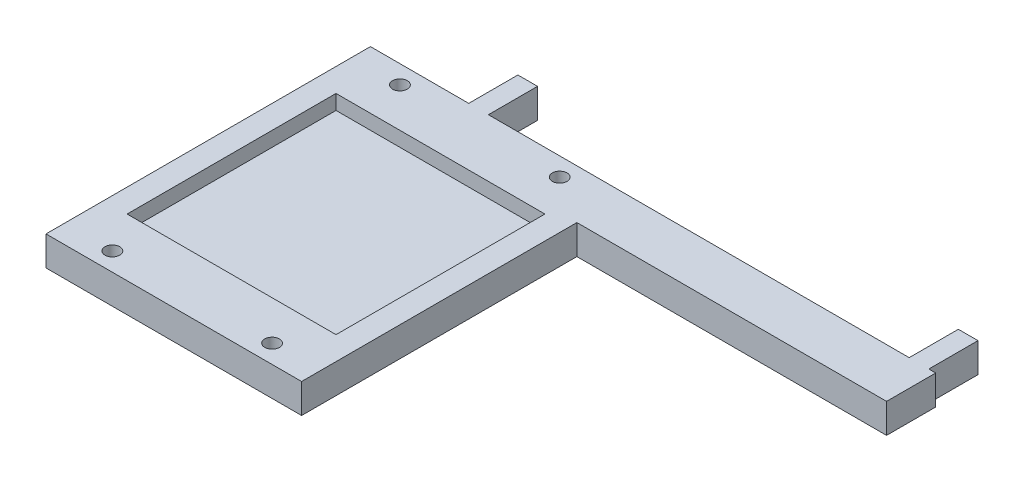
ISO-10303-21;
HEADER;
FILE_DESCRIPTION(('STEP AP214'),'2;1');
FILE_NAME('part.step','',(''),(''),'','','');
FILE_SCHEMA(('AUTOMOTIVE_DESIGN { 1 0 10303 214 1 1 1 1 }'));
ENDSEC;
DATA;
#1=APPLICATION_CONTEXT('core data for automotive mechanical design processes');
#2=APPLICATION_PROTOCOL_DEFINITION('international standard','automotive_design',2000,#1);
#3=PRODUCT_CONTEXT('',#1,'mechanical');
#4=PRODUCT('Part','Part','',(#3));
#5=PRODUCT_RELATED_PRODUCT_CATEGORY('part','',(#4));
#6=PRODUCT_DEFINITION_FORMATION('','',#4);
#7=PRODUCT_DEFINITION_CONTEXT('part definition',#1,'design');
#8=PRODUCT_DEFINITION('design','',#6,#7);
#9=PRODUCT_DEFINITION_SHAPE('','',#8);
#10=(LENGTH_UNIT() NAMED_UNIT(*) SI_UNIT(.MILLI.,.METRE.));
#11=(NAMED_UNIT(*) PLANE_ANGLE_UNIT() SI_UNIT($,.RADIAN.));
#12=(NAMED_UNIT(*) SI_UNIT($,.STERADIAN.) SOLID_ANGLE_UNIT());
#13=UNCERTAINTY_MEASURE_WITH_UNIT(LENGTH_MEASURE(1.E-05),#10,'distance_accuracy_value','');
#14=(GEOMETRIC_REPRESENTATION_CONTEXT(3) GLOBAL_UNCERTAINTY_ASSIGNED_CONTEXT((#13)) GLOBAL_UNIT_ASSIGNED_CONTEXT((#10,
#11,#12)) REPRESENTATION_CONTEXT('',''));
#15=CARTESIAN_POINT('',(0.,0.,0.));
#16=DIRECTION('',(0.,0.,1.));
#17=DIRECTION('',(1.,0.,0.));
#18=AXIS2_PLACEMENT_3D('',#15,#16,#17);
#19=CARTESIAN_POINT('',(0.,6.,0.));
#20=DIRECTION('',(0.,0.,1.));
#21=DIRECTION('',(1.,0.,0.));
#22=AXIS2_PLACEMENT_3D('',#19,#20,#21);
#23=PLANE('',#22);
#24=DIRECTION('',(0.,1.,0.));
#25=VECTOR('',#24,1.);
#26=CARTESIAN_POINT('',(57.6,6.,0.));
#27=LINE('',#26,#25);
#28=CARTESIAN_POINT('',(57.6,0.,0.));
#29=VERTEX_POINT('',#28);
#30=CARTESIAN_POINT('',(57.6,6.,0.));
#31=VERTEX_POINT('',#30);
#32=EDGE_CURVE('E192',#29,#31,#27,.T.);
#33=ORIENTED_EDGE('',*,*,#32,.F.);
#34=DIRECTION('',(-1.,0.,0.));
#35=VECTOR('',#34,1.);
#36=CARTESIAN_POINT('',(0.,0.,0.));
#37=LINE('',#36,#35);
#38=CARTESIAN_POINT('',(-28.,0.,0.));
#39=VERTEX_POINT('',#38);
#40=EDGE_CURVE('E347',#29,#39,#37,.T.);
#41=ORIENTED_EDGE('',*,*,#40,.T.);
#42=DIRECTION('',(0.,-1.,0.));
#43=VECTOR('',#42,1.);
#44=CARTESIAN_POINT('',(-28.,6.,0.));
#45=LINE('',#44,#43);
#46=CARTESIAN_POINT('',(-28.,6.,0.));
#47=VERTEX_POINT('',#46);
#48=EDGE_CURVE('E199',#47,#39,#45,.T.);
#49=ORIENTED_EDGE('',*,*,#48,.F.);
#50=DIRECTION('',(-1.,0.,0.));
#51=VECTOR('',#50,1.);
#52=CARTESIAN_POINT('',(0.,6.,0.));
#53=LINE('',#52,#51);
#54=EDGE_CURVE('E57',#31,#47,#53,.T.);
#55=ORIENTED_EDGE('',*,*,#54,.F.);
#56=EDGE_LOOP('',(#33,#41,#49,#55));
#57=FACE_BOUND('',#56,.T.);
#58=ADVANCED_FACE('F39',(#57),#23,.F.);
#59=DIRECTION('',(0.,-1.,0.));
#60=VECTOR('',#59,1.);
#61=CARTESIAN_POINT('',(61.6,6.,0.));
#62=LINE('',#61,#60);
#63=CARTESIAN_POINT('',(61.6,6.,0.));
#64=VERTEX_POINT('',#63);
#65=CARTESIAN_POINT('',(61.6,0.,0.));
#66=VERTEX_POINT('',#65);
#67=EDGE_CURVE('E65',#64,#66,#62,.T.);
#68=ORIENTED_EDGE('',*,*,#67,.F.);
#69=CARTESIAN_POINT('',(63.,6.,0.));
#70=VERTEX_POINT('',#69);
#71=EDGE_CURVE('E330',#70,#64,#53,.T.);
#72=ORIENTED_EDGE('',*,*,#71,.F.);
#73=DIRECTION('',(0.,1.,0.));
#74=VECTOR('',#73,1.);
#75=CARTESIAN_POINT('',(63.,0.,0.));
#76=LINE('',#75,#74);
#77=CARTESIAN_POINT('',(63.,0.,0.));
#78=VERTEX_POINT('',#77);
#79=EDGE_CURVE('E238',#78,#70,#76,.T.);
#80=ORIENTED_EDGE('',*,*,#79,.F.);
#81=EDGE_CURVE('E343',#78,#66,#37,.T.);
#82=ORIENTED_EDGE('',*,*,#81,.T.);
#83=EDGE_LOOP('',(#68,#72,#80,#82));
#84=FACE_BOUND('',#83,.T.);
#85=ADVANCED_FACE('F428',(#84),#23,.F.);
#86=DIRECTION('',(0.,1.,0.));
#87=VECTOR('',#86,1.);
#88=CARTESIAN_POINT('',(-32.,6.,0.));
#89=LINE('',#88,#87);
#90=CARTESIAN_POINT('',(-32.,0.,0.));
#91=VERTEX_POINT('',#90);
#92=CARTESIAN_POINT('',(-32.,6.,0.));
#93=VERTEX_POINT('',#92);
#94=EDGE_CURVE('E194',#91,#93,#89,.T.);
#95=ORIENTED_EDGE('',*,*,#94,.F.);
#96=CARTESIAN_POINT('',(-52.,0.,0.));
#97=VERTEX_POINT('',#96);
#98=EDGE_CURVE('E342',#91,#97,#37,.T.);
#99=ORIENTED_EDGE('',*,*,#98,.T.);
#100=DIRECTION('',(0.,-1.,0.));
#101=VECTOR('',#100,1.);
#102=CARTESIAN_POINT('',(-52.,6.,0.));
#103=LINE('',#102,#101);
#104=CARTESIAN_POINT('',(-52.,6.,0.));
#105=VERTEX_POINT('',#104);
#106=EDGE_CURVE('E11',#105,#97,#103,.T.);
#107=ORIENTED_EDGE('',*,*,#106,.F.);
#108=EDGE_CURVE('E328',#93,#105,#53,.T.);
#109=ORIENTED_EDGE('',*,*,#108,.F.);
#110=EDGE_LOOP('',(#95,#99,#107,#109));
#111=FACE_BOUND('',#110,.T.);
#112=ADVANCED_FACE('F426',(#111),#23,.F.);
#113=CARTESIAN_POINT('',(0.,6.,0.));
#114=DIRECTION('',(-1.,0.,0.));
#115=DIRECTION('',(0.,0.,1.));
#116=AXIS2_PLACEMENT_3D('',#113,#114,#115);
#117=PLANE('',#116);
#118=DIRECTION('',(0.,-1.,0.));
#119=VECTOR('',#118,1.);
#120=CARTESIAN_POINT('',(0.,0.,10.));
#121=LINE('',#120,#119);
#122=CARTESIAN_POINT('',(0.,6.,10.));
#123=VERTEX_POINT('',#122);
#124=CARTESIAN_POINT('',(0.,0.,10.));
#125=VERTEX_POINT('',#124);
#126=EDGE_CURVE('E237',#123,#125,#121,.T.);
#127=ORIENTED_EDGE('',*,*,#126,.F.);
#128=DIRECTION('',(0.,0.,-1.));
#129=VECTOR('',#128,1.);
#130=CARTESIAN_POINT('',(0.,6.,0.));
#131=LINE('',#130,#129);
#132=CARTESIAN_POINT('',(0.,6.,66.));
#133=VERTEX_POINT('',#132);
#134=EDGE_CURVE('E325',#133,#123,#131,.T.);
#135=ORIENTED_EDGE('',*,*,#134,.F.);
#136=DIRECTION('',(0.,-1.,0.));
#137=VECTOR('',#136,1.);
#138=CARTESIAN_POINT('',(0.,6.,66.));
#139=LINE('',#138,#137);
#140=CARTESIAN_POINT('',(0.,0.,66.));
#141=VERTEX_POINT('',#140);
#142=EDGE_CURVE('E339',#133,#141,#139,.T.);
#143=ORIENTED_EDGE('',*,*,#142,.T.);
#144=DIRECTION('',(0.,0.,-1.));
#145=VECTOR('',#144,1.);
#146=CARTESIAN_POINT('',(0.,0.,0.));
#147=LINE('',#146,#145);
#148=EDGE_CURVE('E315',#141,#125,#147,.T.);
#149=ORIENTED_EDGE('',*,*,#148,.T.);
#150=EDGE_LOOP('',(#127,#135,#143,#149));
#151=FACE_BOUND('',#150,.T.);
#152=ADVANCED_FACE('F41',(#151),#117,.F.);
#153=CARTESIAN_POINT('',(-52.,6.,0.));
#154=DIRECTION('',(1.,0.,0.));
#155=DIRECTION('',(0.,0.,-1.));
#156=AXIS2_PLACEMENT_3D('',#153,#154,#155);
#157=PLANE('',#156);
#158=DIRECTION('',(0.,0.,1.));
#159=VECTOR('',#158,1.);
#160=CARTESIAN_POINT('',(-52.,0.,0.));
#161=LINE('',#160,#159);
#162=CARTESIAN_POINT('',(-52.,0.,66.));
#163=VERTEX_POINT('',#162);
#164=EDGE_CURVE('E346',#97,#163,#161,.T.);
#165=ORIENTED_EDGE('',*,*,#164,.T.);
#166=DIRECTION('',(0.,-1.,0.));
#167=VECTOR('',#166,1.);
#168=CARTESIAN_POINT('',(-52.,6.,66.));
#169=LINE('',#168,#167);
#170=CARTESIAN_POINT('',(-52.,6.,66.));
#171=VERTEX_POINT('',#170);
#172=EDGE_CURVE('E49',#171,#163,#169,.T.);
#173=ORIENTED_EDGE('',*,*,#172,.F.);
#174=DIRECTION('',(0.,0.,1.));
#175=VECTOR('',#174,1.);
#176=CARTESIAN_POINT('',(-52.,6.,0.));
#177=LINE('',#176,#175);
#178=EDGE_CURVE('E333',#105,#171,#177,.T.);
#179=ORIENTED_EDGE('',*,*,#178,.F.);
#180=ORIENTED_EDGE('',*,*,#106,.T.);
#181=EDGE_LOOP('',(#165,#173,#179,#180));
#182=FACE_BOUND('',#181,.T.);
#183=ADVANCED_FACE('F405',(#182),#157,.F.);
#184=CARTESIAN_POINT('',(0.,6.,66.));
#185=DIRECTION('',(0.,0.,-1.));
#186=DIRECTION('',(-1.,0.,0.));
#187=AXIS2_PLACEMENT_3D('',#184,#185,#186);
#188=PLANE('',#187);
#189=DIRECTION('',(1.,0.,0.));
#190=VECTOR('',#189,1.);
#191=CARTESIAN_POINT('',(0.,0.,66.));
#192=LINE('',#191,#190);
#193=EDGE_CURVE('E329',#163,#141,#192,.T.);
#194=ORIENTED_EDGE('',*,*,#193,.T.);
#195=ORIENTED_EDGE('',*,*,#142,.F.);
#196=DIRECTION('',(1.,0.,0.));
#197=VECTOR('',#196,1.);
#198=CARTESIAN_POINT('',(0.,6.,66.));
#199=LINE('',#198,#197);
#200=EDGE_CURVE('E336',#171,#133,#199,.T.);
#201=ORIENTED_EDGE('',*,*,#200,.F.);
#202=ORIENTED_EDGE('',*,*,#172,.T.);
#203=EDGE_LOOP('',(#194,#195,#201,#202));
#204=FACE_BOUND('',#203,.T.);
#205=ADVANCED_FACE('F403',(#204),#188,.F.);
#206=CARTESIAN_POINT('',(0.,6.,0.));
#207=DIRECTION('',(0.,-1.,0.));
#208=DIRECTION('',(0.,0.,-1.));
#209=AXIS2_PLACEMENT_3D('',#206,#207,#208);
#210=PLANE('',#209);
#211=CARTESIAN_POINT('',(-42.25,6.,62.25));
#212=DIRECTION('',(0.,1.,0.));
#213=DIRECTION('',(0.,0.,-1.));
#214=AXIS2_PLACEMENT_3D('',#211,#212,#213);
#215=CIRCLE('',#214,1.50000000000001);
#216=CARTESIAN_POINT('',(-42.25,6.,60.75));
#217=VERTEX_POINT('',#216);
#218=EDGE_CURVE('E263',#217,#217,#215,.T.);
#219=ORIENTED_EDGE('',*,*,#218,.F.);
#220=EDGE_LOOP('',(#219));
#221=FACE_BOUND('',#220,.T.);
#222=CARTESIAN_POINT('',(-9.74999999999999,6.,62.25));
#223=DIRECTION('',(0.,1.,0.));
#224=DIRECTION('',(0.,0.,1.));
#225=AXIS2_PLACEMENT_3D('',#222,#223,#224);
#226=CIRCLE('',#225,1.50000000000001);
#227=CARTESIAN_POINT('',(-9.74999999999999,6.,63.75));
#228=VERTEX_POINT('',#227);
#229=EDGE_CURVE('E269',#228,#228,#226,.T.);
#230=ORIENTED_EDGE('',*,*,#229,.F.);
#231=EDGE_LOOP('',(#230));
#232=FACE_BOUND('',#231,.T.);
#233=CARTESIAN_POINT('',(-9.74999999999999,6.,3.75000000000001));
#234=DIRECTION('',(0.,1.,0.));
#235=DIRECTION('',(0.,0.,-1.));
#236=AXIS2_PLACEMENT_3D('',#233,#234,#235);
#237=CIRCLE('',#236,1.5);
#238=CARTESIAN_POINT('',(-9.74999999999999,6.,2.25000000000001));
#239=VERTEX_POINT('',#238);
#240=EDGE_CURVE('E264',#239,#239,#237,.T.);
#241=ORIENTED_EDGE('',*,*,#240,.F.);
#242=EDGE_LOOP('',(#241));
#243=FACE_BOUND('',#242,.T.);
#244=CARTESIAN_POINT('',(-42.25,6.,3.75000000000001));
#245=DIRECTION('',(0.,1.,0.));
#246=DIRECTION('',(0.,0.,1.));
#247=AXIS2_PLACEMENT_3D('',#244,#245,#246);
#248=CIRCLE('',#247,1.5);
#249=CARTESIAN_POINT('',(-42.25,6.,5.25000000000001));
#250=VERTEX_POINT('',#249);
#251=EDGE_CURVE('E268',#250,#250,#248,.T.);
#252=ORIENTED_EDGE('',*,*,#251,.F.);
#253=EDGE_LOOP('',(#252));
#254=FACE_BOUND('',#253,.T.);
#255=DIRECTION('',(1.,0.,0.));
#256=VECTOR('',#255,1.);
#257=CARTESIAN_POINT('',(-47.25,6.,54.25));
#258=LINE('',#257,#256);
#259=CARTESIAN_POINT('',(-47.25,6.,54.25));
#260=VERTEX_POINT('',#259);
#261=CARTESIAN_POINT('',(-4.74999999999998,6.,54.25));
#262=VERTEX_POINT('',#261);
#263=EDGE_CURVE('E301',#260,#262,#258,.T.);
#264=ORIENTED_EDGE('',*,*,#263,.F.);
#265=DIRECTION('',(0.,0.,1.));
#266=VECTOR('',#265,1.);
#267=CARTESIAN_POINT('',(-47.25,6.,11.75));
#268=LINE('',#267,#266);
#269=CARTESIAN_POINT('',(-47.25,6.,11.75));
#270=VERTEX_POINT('',#269);
#271=EDGE_CURVE('E298',#270,#260,#268,.T.);
#272=ORIENTED_EDGE('',*,*,#271,.F.);
#273=DIRECTION('',(-1.,0.,0.));
#274=VECTOR('',#273,1.);
#275=CARTESIAN_POINT('',(-47.25,6.,11.75));
#276=LINE('',#275,#274);
#277=CARTESIAN_POINT('',(-4.74999999999999,6.,11.75));
#278=VERTEX_POINT('',#277);
#279=EDGE_CURVE('E285',#278,#270,#276,.T.);
#280=ORIENTED_EDGE('',*,*,#279,.F.);
#281=DIRECTION('',(0.,0.,-1.));
#282=VECTOR('',#281,1.);
#283=CARTESIAN_POINT('',(-4.74999999999999,6.,11.75));
#284=LINE('',#283,#282);
#285=EDGE_CURVE('E305',#262,#278,#284,.T.);
#286=ORIENTED_EDGE('',*,*,#285,.F.);
#287=EDGE_LOOP('',(#264,#272,#280,#286));
#288=FACE_BOUND('',#287,.T.);
#289=ORIENTED_EDGE('',*,*,#134,.T.);
#290=DIRECTION('',(-1.,0.,0.));
#291=VECTOR('',#290,1.);
#292=CARTESIAN_POINT('',(63.,6.,9.99999999999999));
#293=LINE('',#292,#291);
#294=CARTESIAN_POINT('',(63.,6.,9.99999999999999));
#295=VERTEX_POINT('',#294);
#296=EDGE_CURVE('E259',#295,#123,#293,.T.);
#297=ORIENTED_EDGE('',*,*,#296,.F.);
#298=DIRECTION('',(0.,0.,1.));
#299=VECTOR('',#298,1.);
#300=CARTESIAN_POINT('',(63.,6.,0.));
#301=LINE('',#300,#299);
#302=EDGE_CURVE('E242',#70,#295,#301,.T.);
#303=ORIENTED_EDGE('',*,*,#302,.F.);
#304=ORIENTED_EDGE('',*,*,#71,.T.);
#305=DIRECTION('',(0.,0.,1.));
#306=VECTOR('',#305,1.);
#307=CARTESIAN_POINT('',(61.6,6.,-10.));
#308=LINE('',#307,#306);
#309=CARTESIAN_POINT('',(61.6,6.,-10.));
#310=VERTEX_POINT('',#309);
#311=EDGE_CURVE('E175',#310,#64,#308,.T.);
#312=ORIENTED_EDGE('',*,*,#311,.F.);
#313=DIRECTION('',(1.,0.,0.));
#314=VECTOR('',#313,1.);
#315=CARTESIAN_POINT('',(57.6,6.,-10.));
#316=LINE('',#315,#314);
#317=CARTESIAN_POINT('',(57.6,6.,-10.));
#318=VERTEX_POINT('',#317);
#319=EDGE_CURVE('E167',#318,#310,#316,.T.);
#320=ORIENTED_EDGE('',*,*,#319,.F.);
#321=DIRECTION('',(0.,0.,1.));
#322=VECTOR('',#321,1.);
#323=CARTESIAN_POINT('',(57.6,6.,-10.));
#324=LINE('',#323,#322);
#325=EDGE_CURVE('E172',#318,#31,#324,.T.);
#326=ORIENTED_EDGE('',*,*,#325,.T.);
#327=ORIENTED_EDGE('',*,*,#54,.T.);
#328=DIRECTION('',(0.,0.,1.));
#329=VECTOR('',#328,1.);
#330=CARTESIAN_POINT('',(-28.,6.,-9.99999999999999));
#331=LINE('',#330,#329);
#332=CARTESIAN_POINT('',(-28.,6.,-9.99999999999999));
#333=VERTEX_POINT('',#332);
#334=EDGE_CURVE('E229',#333,#47,#331,.T.);
#335=ORIENTED_EDGE('',*,*,#334,.F.);
#336=DIRECTION('',(1.,0.,0.));
#337=VECTOR('',#336,1.);
#338=CARTESIAN_POINT('',(-32.,6.,-9.99999999999999));
#339=LINE('',#338,#337);
#340=CARTESIAN_POINT('',(-32.,6.,-9.99999999999999));
#341=VERTEX_POINT('',#340);
#342=EDGE_CURVE('E209',#341,#333,#339,.T.);
#343=ORIENTED_EDGE('',*,*,#342,.F.);
#344=DIRECTION('',(0.,0.,1.));
#345=VECTOR('',#344,1.);
#346=CARTESIAN_POINT('',(-32.,6.,-9.99999999999999));
#347=LINE('',#346,#345);
#348=EDGE_CURVE('E233',#341,#93,#347,.T.);
#349=ORIENTED_EDGE('',*,*,#348,.T.);
#350=ORIENTED_EDGE('',*,*,#108,.T.);
#351=ORIENTED_EDGE('',*,*,#178,.T.);
#352=ORIENTED_EDGE('',*,*,#200,.T.);
#353=EDGE_LOOP('',(#289,#297,#303,#304,#312,#320,#326,#327,#335,#343,#349,#350,#351,#352));
#354=FACE_BOUND('',#353,.T.);
#355=ADVANCED_FACE('F170',(#221,#232,#243,#254,#288,#354),#210,.F.);
#356=CARTESIAN_POINT('',(0.,0.,0.));
#357=DIRECTION('',(0.,-1.,0.));
#358=DIRECTION('',(0.,0.,-1.));
#359=AXIS2_PLACEMENT_3D('',#356,#357,#358);
#360=PLANE('',#359);
#361=CARTESIAN_POINT('',(-42.25,0.,62.25));
#362=DIRECTION('',(0.,-1.,0.));
#363=DIRECTION('',(0.,0.,-1.));
#364=AXIS2_PLACEMENT_3D('',#361,#362,#363);
#365=CIRCLE('',#364,1.50000000000001);
#366=CARTESIAN_POINT('',(-42.25,0.,60.75));
#367=VERTEX_POINT('',#366);
#368=EDGE_CURVE('E43',#367,#367,#365,.T.);
#369=ORIENTED_EDGE('',*,*,#368,.F.);
#370=EDGE_LOOP('',(#369));
#371=FACE_BOUND('',#370,.T.);
#372=CARTESIAN_POINT('',(-9.74999999999999,0.,62.25));
#373=DIRECTION('',(0.,-1.,0.));
#374=DIRECTION('',(0.,0.,-1.));
#375=AXIS2_PLACEMENT_3D('',#372,#373,#374);
#376=CIRCLE('',#375,1.50000000000001);
#377=CARTESIAN_POINT('',(-9.74999999999999,0.,60.75));
#378=VERTEX_POINT('',#377);
#379=EDGE_CURVE('E364',#378,#378,#376,.T.);
#380=ORIENTED_EDGE('',*,*,#379,.F.);
#381=EDGE_LOOP('',(#380));
#382=FACE_BOUND('',#381,.T.);
#383=CARTESIAN_POINT('',(-9.74999999999999,0.,3.75000000000001));
#384=DIRECTION('',(0.,-1.,0.));
#385=DIRECTION('',(0.,0.,-1.));
#386=AXIS2_PLACEMENT_3D('',#383,#384,#385);
#387=CIRCLE('',#386,1.5);
#388=CARTESIAN_POINT('',(-9.74999999999999,0.,2.25000000000001));
#389=VERTEX_POINT('',#388);
#390=EDGE_CURVE('E361',#389,#389,#387,.T.);
#391=ORIENTED_EDGE('',*,*,#390,.F.);
#392=EDGE_LOOP('',(#391));
#393=FACE_BOUND('',#392,.T.);
#394=CARTESIAN_POINT('',(-42.25,0.,3.75000000000001));
#395=DIRECTION('',(0.,-1.,0.));
#396=DIRECTION('',(0.,0.,-1.));
#397=AXIS2_PLACEMENT_3D('',#394,#395,#396);
#398=CIRCLE('',#397,1.5);
#399=CARTESIAN_POINT('',(-42.25,0.,2.25000000000001));
#400=VERTEX_POINT('',#399);
#401=EDGE_CURVE('E279',#400,#400,#398,.T.);
#402=ORIENTED_EDGE('',*,*,#401,.F.);
#403=EDGE_LOOP('',(#402));
#404=FACE_BOUND('',#403,.T.);
#405=ORIENTED_EDGE('',*,*,#148,.F.);
#406=ORIENTED_EDGE('',*,*,#193,.F.);
#407=ORIENTED_EDGE('',*,*,#164,.F.);
#408=ORIENTED_EDGE('',*,*,#98,.F.);
#409=DIRECTION('',(0.,0.,1.));
#410=VECTOR('',#409,1.);
#411=CARTESIAN_POINT('',(-32.,0.,-9.99999999999999));
#412=LINE('',#411,#410);
#413=CARTESIAN_POINT('',(-32.,0.,-9.99999999999999));
#414=VERTEX_POINT('',#413);
#415=EDGE_CURVE('E217',#414,#91,#412,.T.);
#416=ORIENTED_EDGE('',*,*,#415,.F.);
#417=DIRECTION('',(-1.,0.,0.));
#418=VECTOR('',#417,1.);
#419=CARTESIAN_POINT('',(-32.,0.,-9.99999999999999));
#420=LINE('',#419,#418);
#421=CARTESIAN_POINT('',(-28.,0.,-9.99999999999999));
#422=VERTEX_POINT('',#421);
#423=EDGE_CURVE('E215',#422,#414,#420,.T.);
#424=ORIENTED_EDGE('',*,*,#423,.F.);
#425=DIRECTION('',(0.,0.,1.));
#426=VECTOR('',#425,1.);
#427=CARTESIAN_POINT('',(-28.,0.,-9.99999999999999));
#428=LINE('',#427,#426);
#429=EDGE_CURVE('E225',#422,#39,#428,.T.);
#430=ORIENTED_EDGE('',*,*,#429,.T.);
#431=ORIENTED_EDGE('',*,*,#40,.F.);
#432=DIRECTION('',(0.,0.,1.));
#433=VECTOR('',#432,1.);
#434=CARTESIAN_POINT('',(57.6,0.,-10.));
#435=LINE('',#434,#433);
#436=CARTESIAN_POINT('',(57.6,0.,-10.));
#437=VERTEX_POINT('',#436);
#438=EDGE_CURVE('E690',#437,#29,#435,.T.);
#439=ORIENTED_EDGE('',*,*,#438,.F.);
#440=DIRECTION('',(-1.,0.,0.));
#441=VECTOR('',#440,1.);
#442=CARTESIAN_POINT('',(57.6,0.,-10.));
#443=LINE('',#442,#441);
#444=CARTESIAN_POINT('',(61.6,0.,-10.));
#445=VERTEX_POINT('',#444);
#446=EDGE_CURVE('E185',#445,#437,#443,.T.);
#447=ORIENTED_EDGE('',*,*,#446,.F.);
#448=DIRECTION('',(0.,0.,1.));
#449=VECTOR('',#448,1.);
#450=CARTESIAN_POINT('',(61.6,0.,-10.));
#451=LINE('',#450,#449);
#452=EDGE_CURVE('E201',#445,#66,#451,.T.);
#453=ORIENTED_EDGE('',*,*,#452,.T.);
#454=ORIENTED_EDGE('',*,*,#81,.F.);
#455=DIRECTION('',(0.,0.,-1.));
#456=VECTOR('',#455,1.);
#457=CARTESIAN_POINT('',(63.,0.,0.));
#458=LINE('',#457,#456);
#459=CARTESIAN_POINT('',(63.,0.,9.99999999999999));
#460=VERTEX_POINT('',#459);
#461=EDGE_CURVE('E248',#460,#78,#458,.T.);
#462=ORIENTED_EDGE('',*,*,#461,.F.);
#463=DIRECTION('',(-1.,0.,0.));
#464=VECTOR('',#463,1.);
#465=CARTESIAN_POINT('',(63.,0.,9.99999999999999));
#466=LINE('',#465,#464);
#467=EDGE_CURVE('E252',#460,#125,#466,.T.);
#468=ORIENTED_EDGE('',*,*,#467,.T.);
#469=EDGE_LOOP('',(#405,#406,#407,#408,#416,#424,#430,#431,#439,#447,#453,#454,#462,#468));
#470=FACE_BOUND('',#469,.T.);
#471=ADVANCED_FACE('F376',(#371,#382,#393,#404,#470),#360,.T.);
#472=CARTESIAN_POINT('',(-47.25,3.,11.75));
#473=DIRECTION('',(-1.,0.,0.));
#474=DIRECTION('',(0.,0.,1.));
#475=AXIS2_PLACEMENT_3D('',#472,#473,#474);
#476=PLANE('',#475);
#477=ORIENTED_EDGE('',*,*,#271,.T.);
#478=DIRECTION('',(0.,1.,0.));
#479=VECTOR('',#478,1.);
#480=CARTESIAN_POINT('',(-47.25,3.,54.25));
#481=LINE('',#480,#479);
#482=CARTESIAN_POINT('',(-47.25,3.,54.25));
#483=VERTEX_POINT('',#482);
#484=EDGE_CURVE('E297',#483,#260,#481,.T.);
#485=ORIENTED_EDGE('',*,*,#484,.F.);
#486=DIRECTION('',(0.,0.,1.));
#487=VECTOR('',#486,1.);
#488=CARTESIAN_POINT('',(-47.25,3.,11.75));
#489=LINE('',#488,#487);
#490=CARTESIAN_POINT('',(-47.25,3.,11.75));
#491=VERTEX_POINT('',#490);
#492=EDGE_CURVE('E280',#491,#483,#489,.T.);
#493=ORIENTED_EDGE('',*,*,#492,.F.);
#494=DIRECTION('',(0.,1.,0.));
#495=VECTOR('',#494,1.);
#496=CARTESIAN_POINT('',(-47.25,3.,11.75));
#497=LINE('',#496,#495);
#498=EDGE_CURVE('E312',#491,#270,#497,.T.);
#499=ORIENTED_EDGE('',*,*,#498,.T.);
#500=EDGE_LOOP('',(#477,#485,#493,#499));
#501=FACE_BOUND('',#500,.T.);
#502=ADVANCED_FACE('F379',(#501),#476,.F.);
#503=CARTESIAN_POINT('',(-47.25,3.,11.75));
#504=DIRECTION('',(0.,0.,-1.));
#505=DIRECTION('',(-1.,0.,0.));
#506=AXIS2_PLACEMENT_3D('',#503,#504,#505);
#507=PLANE('',#506);
#508=ORIENTED_EDGE('',*,*,#279,.T.);
#509=ORIENTED_EDGE('',*,*,#498,.F.);
#510=DIRECTION('',(-1.,0.,0.));
#511=VECTOR('',#510,1.);
#512=CARTESIAN_POINT('',(-47.25,3.,11.75));
#513=LINE('',#512,#511);
#514=CARTESIAN_POINT('',(-4.74999999999999,3.,11.75));
#515=VERTEX_POINT('',#514);
#516=EDGE_CURVE('E293',#515,#491,#513,.T.);
#517=ORIENTED_EDGE('',*,*,#516,.F.);
#518=DIRECTION('',(0.,1.,0.));
#519=VECTOR('',#518,1.);
#520=CARTESIAN_POINT('',(-4.74999999999999,3.,11.75));
#521=LINE('',#520,#519);
#522=EDGE_CURVE('E316',#515,#278,#521,.T.);
#523=ORIENTED_EDGE('',*,*,#522,.T.);
#524=EDGE_LOOP('',(#508,#509,#517,#523));
#525=FACE_BOUND('',#524,.T.);
#526=ADVANCED_FACE('F548',(#525),#507,.F.);
#527=CARTESIAN_POINT('',(-4.74999999999999,3.,11.75));
#528=DIRECTION('',(1.,0.,0.));
#529=DIRECTION('',(0.,0.,-1.));
#530=AXIS2_PLACEMENT_3D('',#527,#528,#529);
#531=PLANE('',#530);
#532=ORIENTED_EDGE('',*,*,#285,.T.);
#533=ORIENTED_EDGE('',*,*,#522,.F.);
#534=DIRECTION('',(0.,0.,-1.));
#535=VECTOR('',#534,1.);
#536=CARTESIAN_POINT('',(-4.74999999999999,3.,11.75));
#537=LINE('',#536,#535);
#538=CARTESIAN_POINT('',(-4.74999999999998,3.,54.25));
#539=VERTEX_POINT('',#538);
#540=EDGE_CURVE('E289',#539,#515,#537,.T.);
#541=ORIENTED_EDGE('',*,*,#540,.F.);
#542=DIRECTION('',(0.,1.,0.));
#543=VECTOR('',#542,1.);
#544=CARTESIAN_POINT('',(-4.74999999999998,3.,54.25));
#545=LINE('',#544,#543);
#546=EDGE_CURVE('E319',#539,#262,#545,.T.);
#547=ORIENTED_EDGE('',*,*,#546,.T.);
#548=EDGE_LOOP('',(#532,#533,#541,#547));
#549=FACE_BOUND('',#548,.T.);
#550=ADVANCED_FACE('F551',(#549),#531,.F.);
#551=CARTESIAN_POINT('',(-47.25,3.,54.25));
#552=DIRECTION('',(0.,0.,1.));
#553=DIRECTION('',(1.,0.,0.));
#554=AXIS2_PLACEMENT_3D('',#551,#552,#553);
#555=PLANE('',#554);
#556=ORIENTED_EDGE('',*,*,#263,.T.);
#557=ORIENTED_EDGE('',*,*,#546,.F.);
#558=DIRECTION('',(1.,0.,0.));
#559=VECTOR('',#558,1.);
#560=CARTESIAN_POINT('',(-47.25,3.,54.25));
#561=LINE('',#560,#559);
#562=EDGE_CURVE('E284',#483,#539,#561,.T.);
#563=ORIENTED_EDGE('',*,*,#562,.F.);
#564=ORIENTED_EDGE('',*,*,#484,.T.);
#565=EDGE_LOOP('',(#556,#557,#563,#564));
#566=FACE_BOUND('',#565,.T.);
#567=ADVANCED_FACE('F546',(#566),#555,.F.);
#568=CARTESIAN_POINT('',(0.,3.,0.));
#569=DIRECTION('',(0.,1.,0.));
#570=DIRECTION('',(0.,0.,1.));
#571=AXIS2_PLACEMENT_3D('',#568,#569,#570);
#572=PLANE('',#571);
#573=ORIENTED_EDGE('',*,*,#492,.T.);
#574=ORIENTED_EDGE('',*,*,#562,.T.);
#575=ORIENTED_EDGE('',*,*,#540,.T.);
#576=ORIENTED_EDGE('',*,*,#516,.T.);
#577=EDGE_LOOP('',(#573,#574,#575,#576));
#578=FACE_BOUND('',#577,.T.);
#579=ADVANCED_FACE('F542',(#578),#572,.T.);
#580=CARTESIAN_POINT('',(-42.25,-7.,3.75000000000001));
#581=DIRECTION('',(0.,1.,0.));
#582=DIRECTION('',(0.,0.,1.));
#583=AXIS2_PLACEMENT_3D('',#580,#581,#582);
#584=CYLINDRICAL_SURFACE('',#583,1.5);
#585=ORIENTED_EDGE('',*,*,#401,.T.);
#586=EDGE_LOOP('',(#585));
#587=FACE_BOUND('',#586,.T.);
#588=ORIENTED_EDGE('',*,*,#251,.T.);
#589=EDGE_LOOP('',(#588));
#590=FACE_BOUND('',#589,.T.);
#591=ADVANCED_FACE('F535',(#587,#590),#584,.F.);
#592=CARTESIAN_POINT('',(-9.74999999999999,-7.,3.75000000000001));
#593=DIRECTION('',(0.,1.,0.));
#594=DIRECTION('',(0.,0.,1.));
#595=AXIS2_PLACEMENT_3D('',#592,#593,#594);
#596=CYLINDRICAL_SURFACE('',#595,1.5);
#597=ORIENTED_EDGE('',*,*,#390,.T.);
#598=EDGE_LOOP('',(#597));
#599=FACE_BOUND('',#598,.T.);
#600=ORIENTED_EDGE('',*,*,#240,.T.);
#601=EDGE_LOOP('',(#600));
#602=FACE_BOUND('',#601,.T.);
#603=ADVANCED_FACE('F531',(#599,#602),#596,.F.);
#604=CARTESIAN_POINT('',(-9.74999999999999,-7.,62.25));
#605=DIRECTION('',(0.,1.,0.));
#606=DIRECTION('',(0.,0.,1.));
#607=AXIS2_PLACEMENT_3D('',#604,#605,#606);
#608=CYLINDRICAL_SURFACE('',#607,1.50000000000001);
#609=ORIENTED_EDGE('',*,*,#379,.T.);
#610=EDGE_LOOP('',(#609));
#611=FACE_BOUND('',#610,.T.);
#612=ORIENTED_EDGE('',*,*,#229,.T.);
#613=EDGE_LOOP('',(#612));
#614=FACE_BOUND('',#613,.T.);
#615=ADVANCED_FACE('F534',(#611,#614),#608,.F.);
#616=CARTESIAN_POINT('',(-42.25,-7.,62.25));
#617=DIRECTION('',(0.,1.,0.));
#618=DIRECTION('',(0.,0.,1.));
#619=AXIS2_PLACEMENT_3D('',#616,#617,#618);
#620=CYLINDRICAL_SURFACE('',#619,1.50000000000001);
#621=ORIENTED_EDGE('',*,*,#368,.T.);
#622=EDGE_LOOP('',(#621));
#623=FACE_BOUND('',#622,.T.);
#624=ORIENTED_EDGE('',*,*,#218,.T.);
#625=EDGE_LOOP('',(#624));
#626=FACE_BOUND('',#625,.T.);
#627=ADVANCED_FACE('F373',(#623,#626),#620,.F.);
#628=CARTESIAN_POINT('',(63.,0.,9.99999999999999));
#629=DIRECTION('',(0.,0.,-1.));
#630=DIRECTION('',(0.,1.,0.));
#631=AXIS2_PLACEMENT_3D('',#628,#629,#630);
#632=PLANE('',#631);
#633=ORIENTED_EDGE('',*,*,#126,.T.);
#634=ORIENTED_EDGE('',*,*,#467,.F.);
#635=DIRECTION('',(0.,-1.,0.));
#636=VECTOR('',#635,1.);
#637=CARTESIAN_POINT('',(63.,0.,9.99999999999999));
#638=LINE('',#637,#636);
#639=EDGE_CURVE('E245',#295,#460,#638,.T.);
#640=ORIENTED_EDGE('',*,*,#639,.F.);
#641=ORIENTED_EDGE('',*,*,#296,.T.);
#642=EDGE_LOOP('',(#633,#634,#640,#641));
#643=FACE_BOUND('',#642,.T.);
#644=ADVANCED_FACE('F395',(#643),#632,.F.);
#645=CARTESIAN_POINT('',(63.,0.,0.));
#646=DIRECTION('',(1.,0.,0.));
#647=DIRECTION('',(0.,0.,-1.));
#648=AXIS2_PLACEMENT_3D('',#645,#646,#647);
#649=PLANE('',#648);
#650=ORIENTED_EDGE('',*,*,#79,.T.);
#651=ORIENTED_EDGE('',*,*,#302,.T.);
#652=ORIENTED_EDGE('',*,*,#639,.T.);
#653=ORIENTED_EDGE('',*,*,#461,.T.);
#654=EDGE_LOOP('',(#650,#651,#652,#653));
#655=FACE_BOUND('',#654,.T.);
#656=ADVANCED_FACE('F480',(#655),#649,.T.);
#657=CARTESIAN_POINT('',(-32.,6.,-9.99999999999999));
#658=DIRECTION('',(1.,0.,0.));
#659=DIRECTION('',(0.,0.,-1.));
#660=AXIS2_PLACEMENT_3D('',#657,#658,#659);
#661=PLANE('',#660);
#662=ORIENTED_EDGE('',*,*,#94,.T.);
#663=ORIENTED_EDGE('',*,*,#348,.F.);
#664=DIRECTION('',(0.,1.,0.));
#665=VECTOR('',#664,1.);
#666=CARTESIAN_POINT('',(-32.,6.,-9.99999999999999));
#667=LINE('',#666,#665);
#668=EDGE_CURVE('E205',#414,#341,#667,.T.);
#669=ORIENTED_EDGE('',*,*,#668,.F.);
#670=ORIENTED_EDGE('',*,*,#415,.T.);
#671=EDGE_LOOP('',(#662,#663,#669,#670));
#672=FACE_BOUND('',#671,.T.);
#673=ADVANCED_FACE('F414',(#672),#661,.F.);
#674=CARTESIAN_POINT('',(-28.,6.,-9.99999999999999));
#675=DIRECTION('',(-1.,0.,0.));
#676=DIRECTION('',(0.,-1.,0.));
#677=AXIS2_PLACEMENT_3D('',#674,#675,#676);
#678=PLANE('',#677);
#679=ORIENTED_EDGE('',*,*,#48,.T.);
#680=ORIENTED_EDGE('',*,*,#429,.F.);
#681=DIRECTION('',(0.,-1.,0.));
#682=VECTOR('',#681,1.);
#683=CARTESIAN_POINT('',(-28.,6.,-9.99999999999999));
#684=LINE('',#683,#682);
#685=EDGE_CURVE('E212',#333,#422,#684,.T.);
#686=ORIENTED_EDGE('',*,*,#685,.F.);
#687=ORIENTED_EDGE('',*,*,#334,.T.);
#688=EDGE_LOOP('',(#679,#680,#686,#687));
#689=FACE_BOUND('',#688,.T.);
#690=ADVANCED_FACE('F422',(#689),#678,.F.);
#691=CARTESIAN_POINT('',(0.,0.,-10.));
#692=DIRECTION('',(0.,0.,1.));
#693=DIRECTION('',(1.,0.,0.));
#694=AXIS2_PLACEMENT_3D('',#691,#692,#693);
#695=PLANE('',#694);
#696=ORIENTED_EDGE('',*,*,#668,.T.);
#697=ORIENTED_EDGE('',*,*,#342,.T.);
#698=ORIENTED_EDGE('',*,*,#685,.T.);
#699=ORIENTED_EDGE('',*,*,#423,.T.);
#700=EDGE_LOOP('',(#696,#697,#698,#699));
#701=FACE_BOUND('',#700,.T.);
#702=ADVANCED_FACE('F417',(#701),#695,.F.);
#703=CARTESIAN_POINT('',(57.6,6.,-10.));
#704=DIRECTION('',(1.,0.,0.));
#705=DIRECTION('',(0.,0.,-1.));
#706=AXIS2_PLACEMENT_3D('',#703,#704,#705);
#707=PLANE('',#706);
#708=ORIENTED_EDGE('',*,*,#32,.T.);
#709=ORIENTED_EDGE('',*,*,#325,.F.);
#710=DIRECTION('',(0.,1.,0.));
#711=VECTOR('',#710,1.);
#712=CARTESIAN_POINT('',(57.6,6.,-10.));
#713=LINE('',#712,#711);
#714=EDGE_CURVE('E180',#437,#318,#713,.T.);
#715=ORIENTED_EDGE('',*,*,#714,.F.);
#716=ORIENTED_EDGE('',*,*,#438,.T.);
#717=EDGE_LOOP('',(#708,#709,#715,#716));
#718=FACE_BOUND('',#717,.T.);
#719=ADVANCED_FACE('F191',(#718),#707,.F.);
#720=CARTESIAN_POINT('',(61.6,6.,-10.));
#721=DIRECTION('',(-1.,0.,0.));
#722=DIRECTION('',(0.,0.,1.));
#723=AXIS2_PLACEMENT_3D('',#720,#721,#722);
#724=PLANE('',#723);
#725=ORIENTED_EDGE('',*,*,#67,.T.);
#726=ORIENTED_EDGE('',*,*,#452,.F.);
#727=DIRECTION('',(0.,-1.,0.));
#728=VECTOR('',#727,1.);
#729=CARTESIAN_POINT('',(61.6,6.,-10.));
#730=LINE('',#729,#728);
#731=EDGE_CURVE('E179',#310,#445,#730,.T.);
#732=ORIENTED_EDGE('',*,*,#731,.F.);
#733=ORIENTED_EDGE('',*,*,#311,.T.);
#734=EDGE_LOOP('',(#725,#726,#732,#733));
#735=FACE_BOUND('',#734,.T.);
#736=ADVANCED_FACE('F506',(#735),#724,.F.);
#737=CARTESIAN_POINT('',(0.,0.,-10.));
#738=DIRECTION('',(0.,0.,1.));
#739=DIRECTION('',(1.,0.,0.));
#740=AXIS2_PLACEMENT_3D('',#737,#738,#739);
#741=PLANE('',#740);
#742=ORIENTED_EDGE('',*,*,#714,.T.);
#743=ORIENTED_EDGE('',*,*,#319,.T.);
#744=ORIENTED_EDGE('',*,*,#731,.T.);
#745=ORIENTED_EDGE('',*,*,#446,.T.);
#746=EDGE_LOOP('',(#742,#743,#744,#745));
#747=FACE_BOUND('',#746,.T.);
#748=ADVANCED_FACE('F183',(#747),#741,.F.);
#749=CLOSED_SHELL('',(#58,#85,#112,#152,#183,#205,#355,#471,#502,#526,#550,#567,#579,#591,#603,
#615,#627,#644,#656,#673,#690,#702,#719,#736,#748));
#750=MANIFOLD_SOLID_BREP('B2',#749);
#751=ADVANCED_BREP_SHAPE_REPRESENTATION('',(#18,#750),#14);
#752=SHAPE_DEFINITION_REPRESENTATION(#9,#751);
ENDSEC;
END-ISO-10303-21;
